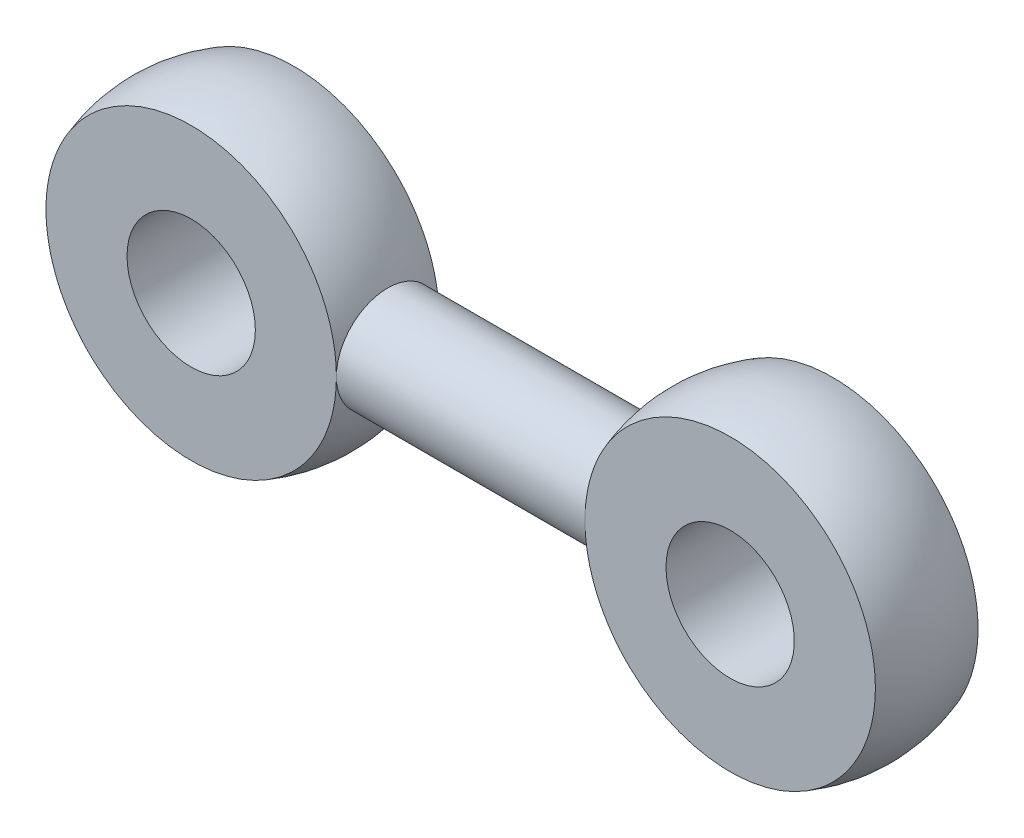
ISO-10303-21;
HEADER;
FILE_DESCRIPTION(('STEP AP214'),'2;1');
FILE_NAME('part.step','',(''),(''),'','','');
FILE_SCHEMA(('AUTOMOTIVE_DESIGN { 1 0 10303 214 1 1 1 1 }'));
ENDSEC;
DATA;
#1=APPLICATION_CONTEXT('core data for automotive mechanical design processes');
#2=APPLICATION_PROTOCOL_DEFINITION('international standard','automotive_design',2000,#1);
#3=PRODUCT_CONTEXT('',#1,'mechanical');
#4=PRODUCT('Part','Part','',(#3));
#5=PRODUCT_RELATED_PRODUCT_CATEGORY('part','',(#4));
#6=PRODUCT_DEFINITION_FORMATION('','',#4);
#7=PRODUCT_DEFINITION_CONTEXT('part definition',#1,'design');
#8=PRODUCT_DEFINITION('design','',#6,#7);
#9=PRODUCT_DEFINITION_SHAPE('','',#8);
#10=(LENGTH_UNIT() NAMED_UNIT(*) SI_UNIT(.MILLI.,.METRE.));
#11=(NAMED_UNIT(*) PLANE_ANGLE_UNIT() SI_UNIT($,.RADIAN.));
#12=(NAMED_UNIT(*) SI_UNIT($,.STERADIAN.) SOLID_ANGLE_UNIT());
#13=UNCERTAINTY_MEASURE_WITH_UNIT(LENGTH_MEASURE(1.E-05),#10,'distance_accuracy_value','');
#14=(GEOMETRIC_REPRESENTATION_CONTEXT(3) GLOBAL_UNCERTAINTY_ASSIGNED_CONTEXT((#13)) GLOBAL_UNIT_ASSIGNED_CONTEXT((#10,
#11,#12)) REPRESENTATION_CONTEXT('',''));
#15=CARTESIAN_POINT('',(0.,0.,0.));
#16=DIRECTION('',(0.,0.,1.));
#17=DIRECTION('',(1.,0.,0.));
#18=AXIS2_PLACEMENT_3D('',#15,#16,#17);
#19=CARTESIAN_POINT('',(-21.,0.,0.));
#20=DIRECTION('',(1.,0.,0.));
#21=DIRECTION('',(0.,1.,0.));
#22=AXIS2_PLACEMENT_3D('',#19,#20,#21);
#23=SPHERICAL_SURFACE('',#22,6.);
#24=CARTESIAN_POINT('',(-15.3431457505076,0.,0.));
#25=DIRECTION('',(1.,0.,0.));
#26=DIRECTION('',(0.,0.,-1.));
#27=AXIS2_PLACEMENT_3D('',#24,#25,#26);
#28=CIRCLE('',#27,2.);
#29=CARTESIAN_POINT('',(-15.3431457505076,0.,2.));
#30=VERTEX_POINT('',#29);
#31=CARTESIAN_POINT('',(-15.3431457505076,0.,-2.));
#32=VERTEX_POINT('',#31);
#33=EDGE_CURVE('E62',#30,#32,#28,.T.);
#34=ORIENTED_EDGE('',*,*,#33,.F.);
#35=CARTESIAN_POINT('',(-21.,0.,2.));
#36=DIRECTION('',(0.,0.,1.));
#37=DIRECTION('',(1.,0.,0.));
#38=AXIS2_PLACEMENT_3D('',#35,#36,#37);
#39=CIRCLE('',#38,5.65685424949238);
#40=EDGE_CURVE('E11',#30,#30,#39,.F.);
#41=ORIENTED_EDGE('',*,*,#40,.T.);
#42=EDGE_CURVE('E64',#32,#30,#28,.T.);
#43=ORIENTED_EDGE('',*,*,#42,.F.);
#44=CARTESIAN_POINT('',(-21.,0.,-2.));
#45=DIRECTION('',(0.,0.,-1.));
#46=DIRECTION('',(-1.,0.,0.));
#47=AXIS2_PLACEMENT_3D('',#44,#45,#46);
#48=CIRCLE('',#47,5.65685424949238);
#49=EDGE_CURVE('E43',#32,#32,#48,.F.);
#50=ORIENTED_EDGE('',*,*,#49,.T.);
#51=EDGE_LOOP('',(#34,#41,#43,#50));
#52=FACE_BOUND('',#51,.T.);
#53=ADVANCED_FACE('F34',(#52),#23,.T.);
#54=CARTESIAN_POINT('',(0.,0.,0.));
#55=DIRECTION('',(1.,0.,0.));
#56=DIRECTION('',(0.,-1.,0.));
#57=AXIS2_PLACEMENT_3D('',#54,#55,#56);
#58=SPHERICAL_SURFACE('',#57,6.);
#59=CARTESIAN_POINT('',(-5.65685424949238,0.,0.));
#60=DIRECTION('',(1.,0.,0.));
#61=DIRECTION('',(0.,0.,-1.));
#62=AXIS2_PLACEMENT_3D('',#59,#60,#61);
#63=CIRCLE('',#62,2.);
#64=CARTESIAN_POINT('',(-5.65685424949238,0.,2.));
#65=VERTEX_POINT('',#64);
#66=CARTESIAN_POINT('',(-5.65685424949238,0.,-2.));
#67=VERTEX_POINT('',#66);
#68=EDGE_CURVE('E76',#65,#67,#63,.T.);
#69=ORIENTED_EDGE('',*,*,#68,.T.);
#70=CARTESIAN_POINT('',(0.,0.,-2.));
#71=DIRECTION('',(0.,0.,1.));
#72=DIRECTION('',(1.,0.,0.));
#73=AXIS2_PLACEMENT_3D('',#70,#71,#72);
#74=CIRCLE('',#73,5.65685424949238);
#75=EDGE_CURVE('E51',#67,#67,#74,.F.);
#76=ORIENTED_EDGE('',*,*,#75,.F.);
#77=EDGE_CURVE('E73',#67,#65,#63,.T.);
#78=ORIENTED_EDGE('',*,*,#77,.T.);
#79=CARTESIAN_POINT('',(0.,0.,2.));
#80=DIRECTION('',(0.,0.,-1.));
#81=DIRECTION('',(-1.,0.,0.));
#82=AXIS2_PLACEMENT_3D('',#79,#80,#81);
#83=CIRCLE('',#82,5.65685424949238);
#84=EDGE_CURVE('E67',#65,#65,#83,.F.);
#85=ORIENTED_EDGE('',*,*,#84,.F.);
#86=EDGE_LOOP('',(#69,#76,#78,#85));
#87=FACE_BOUND('',#86,.T.);
#88=ADVANCED_FACE('F36',(#87),#58,.T.);
#89=CARTESIAN_POINT('',(6.21465699734194,0.,0.));
#90=DIRECTION('',(1.,0.,0.));
#91=DIRECTION('',(0.,0.,-1.));
#92=AXIS2_PLACEMENT_3D('',#89,#90,#91);
#93=CYLINDRICAL_SURFACE('',#92,2.);
#94=ORIENTED_EDGE('',*,*,#42,.T.);
#95=ORIENTED_EDGE('',*,*,#33,.T.);
#96=EDGE_LOOP('',(#94,#95));
#97=FACE_BOUND('',#96,.T.);
#98=ORIENTED_EDGE('',*,*,#77,.F.);
#99=ORIENTED_EDGE('',*,*,#68,.F.);
#100=EDGE_LOOP('',(#98,#99));
#101=FACE_BOUND('',#100,.T.);
#102=ADVANCED_FACE('F108',(#97,#101),#93,.T.);
#103=CARTESIAN_POINT('',(-5.65685424949238,-6.,2.));
#104=DIRECTION('',(0.,0.,-1.));
#105=DIRECTION('',(-1.,0.,0.));
#106=AXIS2_PLACEMENT_3D('',#103,#104,#105);
#107=PLANE('',#106);
#108=CARTESIAN_POINT('',(0.,0.,2.));
#109=DIRECTION('',(0.,0.,-1.));
#110=DIRECTION('',(-1.,0.,0.));
#111=AXIS2_PLACEMENT_3D('',#108,#109,#110);
#112=CIRCLE('',#111,2.5);
#113=CARTESIAN_POINT('',(-2.5,0.,2.));
#114=VERTEX_POINT('',#113);
#115=EDGE_CURVE('E77',#114,#114,#112,.F.);
#116=ORIENTED_EDGE('',*,*,#115,.F.);
#117=EDGE_LOOP('',(#116));
#118=FACE_BOUND('',#117,.T.);
#119=ORIENTED_EDGE('',*,*,#84,.T.);
#120=EDGE_LOOP('',(#119));
#121=FACE_BOUND('',#120,.T.);
#122=ADVANCED_FACE('F113',(#118,#121),#107,.F.);
#123=CARTESIAN_POINT('',(-5.65685424949238,-6.,-2.00000000000001));
#124=DIRECTION('',(0.,0.,1.));
#125=DIRECTION('',(1.,0.,0.));
#126=AXIS2_PLACEMENT_3D('',#123,#124,#125);
#127=PLANE('',#126);
#128=CARTESIAN_POINT('',(0.,0.,-2.));
#129=DIRECTION('',(0.,0.,-1.));
#130=DIRECTION('',(-1.,0.,0.));
#131=AXIS2_PLACEMENT_3D('',#128,#129,#130);
#132=CIRCLE('',#131,2.5);
#133=CARTESIAN_POINT('',(-2.5,0.,-2.));
#134=VERTEX_POINT('',#133);
#135=EDGE_CURVE('E80',#134,#134,#132,.T.);
#136=ORIENTED_EDGE('',*,*,#135,.F.);
#137=EDGE_LOOP('',(#136));
#138=FACE_BOUND('',#137,.T.);
#139=ORIENTED_EDGE('',*,*,#75,.T.);
#140=EDGE_LOOP('',(#139));
#141=FACE_BOUND('',#140,.T.);
#142=ADVANCED_FACE('F117',(#138,#141),#127,.F.);
#143=CARTESIAN_POINT('',(0.,0.,6.00100000000001));
#144=DIRECTION('',(0.,0.,-1.));
#145=DIRECTION('',(-1.,0.,0.));
#146=AXIS2_PLACEMENT_3D('',#143,#144,#145);
#147=CYLINDRICAL_SURFACE('',#146,2.5);
#148=ORIENTED_EDGE('',*,*,#135,.T.);
#149=EDGE_LOOP('',(#148));
#150=FACE_BOUND('',#149,.T.);
#151=ORIENTED_EDGE('',*,*,#115,.T.);
#152=EDGE_LOOP('',(#151));
#153=FACE_BOUND('',#152,.T.);
#154=ADVANCED_FACE('F101',(#150,#153),#147,.F.);
#155=CARTESIAN_POINT('',(-15.3431457505076,10.,-2.));
#156=DIRECTION('',(0.,0.,-1.));
#157=DIRECTION('',(-1.,0.,0.));
#158=AXIS2_PLACEMENT_3D('',#155,#156,#157);
#159=PLANE('',#158);
#160=CARTESIAN_POINT('',(-21.,0.,-2.));
#161=DIRECTION('',(0.,0.,-1.));
#162=DIRECTION('',(-1.,0.,0.));
#163=AXIS2_PLACEMENT_3D('',#160,#161,#162);
#164=CIRCLE('',#163,2.5);
#165=CARTESIAN_POINT('',(-23.5,0.,-2.));
#166=VERTEX_POINT('',#165);
#167=EDGE_CURVE('E83',#166,#166,#164,.T.);
#168=ORIENTED_EDGE('',*,*,#167,.F.);
#169=EDGE_LOOP('',(#168));
#170=FACE_BOUND('',#169,.T.);
#171=ORIENTED_EDGE('',*,*,#49,.F.);
#172=EDGE_LOOP('',(#171));
#173=FACE_BOUND('',#172,.T.);
#174=ADVANCED_FACE('F94',(#170,#173),#159,.T.);
#175=CARTESIAN_POINT('',(-15.3431457505076,10.,2.));
#176=DIRECTION('',(0.,0.,1.));
#177=DIRECTION('',(1.,0.,0.));
#178=AXIS2_PLACEMENT_3D('',#175,#176,#177);
#179=PLANE('',#178);
#180=CARTESIAN_POINT('',(-21.,0.,2.));
#181=DIRECTION('',(0.,0.,1.));
#182=DIRECTION('',(1.,0.,0.));
#183=AXIS2_PLACEMENT_3D('',#180,#181,#182);
#184=CIRCLE('',#183,2.5);
#185=CARTESIAN_POINT('',(-18.5,0.,2.));
#186=VERTEX_POINT('',#185);
#187=EDGE_CURVE('E38',#186,#186,#184,.T.);
#188=ORIENTED_EDGE('',*,*,#187,.F.);
#189=EDGE_LOOP('',(#188));
#190=FACE_BOUND('',#189,.T.);
#191=ORIENTED_EDGE('',*,*,#40,.F.);
#192=EDGE_LOOP('',(#191));
#193=FACE_BOUND('',#192,.T.);
#194=ADVANCED_FACE('F92',(#190,#193),#179,.T.);
#195=CARTESIAN_POINT('',(-21.,0.,8.));
#196=DIRECTION('',(0.,0.,-1.));
#197=DIRECTION('',(-1.,0.,0.));
#198=AXIS2_PLACEMENT_3D('',#195,#196,#197);
#199=CYLINDRICAL_SURFACE('',#198,2.5);
#200=ORIENTED_EDGE('',*,*,#187,.T.);
#201=EDGE_LOOP('',(#200));
#202=FACE_BOUND('',#201,.T.);
#203=ORIENTED_EDGE('',*,*,#167,.T.);
#204=EDGE_LOOP('',(#203));
#205=FACE_BOUND('',#204,.T.);
#206=ADVANCED_FACE('F90',(#202,#205),#199,.F.);
#207=CLOSED_SHELL('',(#53,#88,#102,#122,#142,#154,#174,#194,#206));
#208=MANIFOLD_SOLID_BREP('B2',#207);
#209=ADVANCED_BREP_SHAPE_REPRESENTATION('',(#18,#208),#14);
#210=SHAPE_DEFINITION_REPRESENTATION(#9,#209);
ENDSEC;
END-ISO-10303-21;
